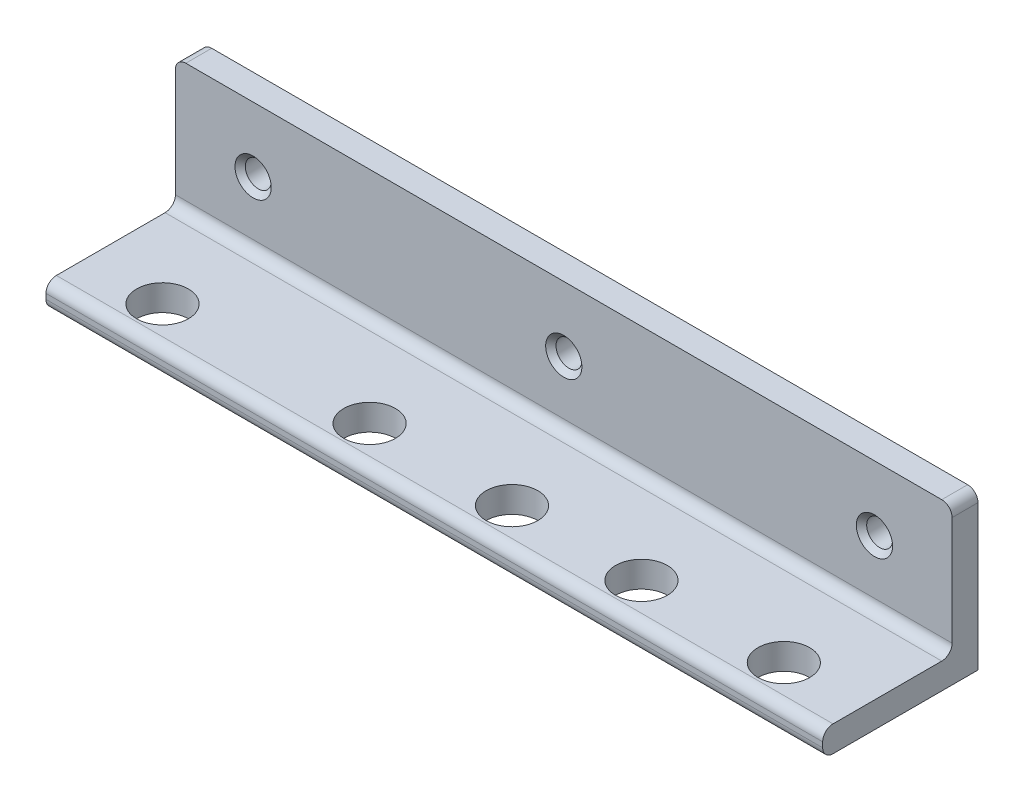
ISO-10303-21;
HEADER;
FILE_DESCRIPTION(('STEP AP214'),'2;1');
FILE_NAME('part.step','',(''),(''),'','','');
FILE_SCHEMA(('AUTOMOTIVE_DESIGN { 1 0 10303 214 1 1 1 1 }'));
ENDSEC;
DATA;
#1=APPLICATION_CONTEXT('core data for automotive mechanical design processes');
#2=APPLICATION_PROTOCOL_DEFINITION('international standard','automotive_design',2000,#1);
#3=PRODUCT_CONTEXT('',#1,'mechanical');
#4=PRODUCT('Part','Part','',(#3));
#5=PRODUCT_RELATED_PRODUCT_CATEGORY('part','',(#4));
#6=PRODUCT_DEFINITION_FORMATION('','',#4);
#7=PRODUCT_DEFINITION_CONTEXT('part definition',#1,'design');
#8=PRODUCT_DEFINITION('design','',#6,#7);
#9=PRODUCT_DEFINITION_SHAPE('','',#8);
#10=(LENGTH_UNIT() NAMED_UNIT(*) SI_UNIT(.MILLI.,.METRE.));
#11=(NAMED_UNIT(*) PLANE_ANGLE_UNIT() SI_UNIT($,.RADIAN.));
#12=(NAMED_UNIT(*) SI_UNIT($,.STERADIAN.) SOLID_ANGLE_UNIT());
#13=UNCERTAINTY_MEASURE_WITH_UNIT(LENGTH_MEASURE(1.E-05),#10,'distance_accuracy_value','');
#14=(GEOMETRIC_REPRESENTATION_CONTEXT(3) GLOBAL_UNCERTAINTY_ASSIGNED_CONTEXT((#13)) GLOBAL_UNIT_ASSIGNED_CONTEXT((#10,
#11,#12)) REPRESENTATION_CONTEXT('',''));
#15=CARTESIAN_POINT('',(0.,0.,0.));
#16=DIRECTION('',(0.,0.,1.));
#17=DIRECTION('',(1.,0.,0.));
#18=AXIS2_PLACEMENT_3D('',#15,#16,#17);
#19=CARTESIAN_POINT('',(0.,5.,0.));
#20=DIRECTION('',(0.,-1.,0.));
#21=DIRECTION('',(0.,0.,-1.));
#22=AXIS2_PLACEMENT_3D('',#19,#20,#21);
#23=PLANE('',#22);
#24=CARTESIAN_POINT('',(-37.6911971364308,5.,8.3157155240969));
#25=DIRECTION('',(0.,1.,0.));
#26=DIRECTION('',(0.,0.,-1.));
#27=AXIS2_PLACEMENT_3D('',#24,#25,#26);
#28=CIRCLE('',#27,5.);
#29=CARTESIAN_POINT('',(-37.6911971364308,5.,3.3157155240969));
#30=VERTEX_POINT('',#29);
#31=EDGE_CURVE('E265',#30,#30,#28,.T.);
#32=ORIENTED_EDGE('',*,*,#31,.F.);
#33=EDGE_LOOP('',(#32));
#34=FACE_BOUND('',#33,.T.);
#35=CARTESIAN_POINT('',(2.30880286356919,5.,8.3157155240969));
#36=DIRECTION('',(0.,1.,0.));
#37=DIRECTION('',(0.,0.,-1.));
#38=AXIS2_PLACEMENT_3D('',#35,#36,#37);
#39=CIRCLE('',#38,4.99999999999999);
#40=CARTESIAN_POINT('',(2.30880286356919,5.,3.31571552409691));
#41=VERTEX_POINT('',#40);
#42=EDGE_CURVE('E261',#41,#41,#39,.T.);
#43=ORIENTED_EDGE('',*,*,#42,.F.);
#44=EDGE_LOOP('',(#43));
#45=FACE_BOUND('',#44,.T.);
#46=CARTESIAN_POINT('',(29.8088028635692,5.,8.3157155240969));
#47=DIRECTION('',(0.,1.,0.));
#48=DIRECTION('',(0.,0.,-1.));
#49=AXIS2_PLACEMENT_3D('',#46,#47,#48);
#50=CIRCLE('',#49,5.00000000000002);
#51=CARTESIAN_POINT('',(29.8088028635692,5.,3.31571552409688));
#52=VERTEX_POINT('',#51);
#53=EDGE_CURVE('E257',#52,#52,#50,.T.);
#54=ORIENTED_EDGE('',*,*,#53,.F.);
#55=EDGE_LOOP('',(#54));
#56=FACE_BOUND('',#55,.T.);
#57=CARTESIAN_POINT('',(54.8088028635692,5.,8.3157155240969));
#58=DIRECTION('',(0.,1.,0.));
#59=DIRECTION('',(0.,0.,-1.));
#60=AXIS2_PLACEMENT_3D('',#57,#58,#59);
#61=CIRCLE('',#60,5.00000000000002);
#62=CARTESIAN_POINT('',(54.8088028635692,5.,3.31571552409688));
#63=VERTEX_POINT('',#62);
#64=EDGE_CURVE('E253',#63,#63,#61,.T.);
#65=ORIENTED_EDGE('',*,*,#64,.F.);
#66=EDGE_LOOP('',(#65));
#67=FACE_BOUND('',#66,.T.);
#68=CARTESIAN_POINT('',(82.3088028635692,5.,8.3157155240969));
#69=DIRECTION('',(0.,1.,0.));
#70=DIRECTION('',(0.,0.,-1.));
#71=AXIS2_PLACEMENT_3D('',#68,#69,#70);
#72=CIRCLE('',#71,4.99999999999999);
#73=CARTESIAN_POINT('',(82.3088028635692,5.,3.31571552409691));
#74=VERTEX_POINT('',#73);
#75=EDGE_CURVE('E249',#74,#74,#72,.T.);
#76=ORIENTED_EDGE('',*,*,#75,.F.);
#77=EDGE_LOOP('',(#76));
#78=FACE_BOUND('',#77,.T.);
#79=DIRECTION('',(0.,0.,1.));
#80=VECTOR('',#79,1.);
#81=CARTESIAN_POINT('',(-52.6911971364308,5.,15.8157155240969));
#82=LINE('',#81,#80);
#83=CARTESIAN_POINT('',(-52.6911971364308,5.,-7.1842844759031));
#84=VERTEX_POINT('',#83);
#85=CARTESIAN_POINT('',(-52.6911971364308,5.,13.8157155240969));
#86=VERTEX_POINT('',#85);
#87=EDGE_CURVE('E139',#84,#86,#82,.T.);
#88=ORIENTED_EDGE('',*,*,#87,.T.);
#89=DIRECTION('',(1.,0.,0.));
#90=VECTOR('',#89,1.);
#91=CARTESIAN_POINT('',(0.,5.,13.8157155240969));
#92=LINE('',#91,#90);
#93=CARTESIAN_POINT('',(97.3088028635692,5.,13.8157155240969));
#94=VERTEX_POINT('',#93);
#95=EDGE_CURVE('E163',#86,#94,#92,.T.);
#96=ORIENTED_EDGE('',*,*,#95,.T.);
#97=DIRECTION('',(0.,0.,-1.));
#98=VECTOR('',#97,1.);
#99=CARTESIAN_POINT('',(97.3088028635692,5.,15.8157155240969));
#100=LINE('',#99,#98);
#101=CARTESIAN_POINT('',(97.3088028635692,5.,-7.18428447590311));
#102=VERTEX_POINT('',#101);
#103=EDGE_CURVE('E142',#94,#102,#100,.T.);
#104=ORIENTED_EDGE('',*,*,#103,.T.);
#105=DIRECTION('',(1.,0.,0.));
#106=VECTOR('',#105,1.);
#107=CARTESIAN_POINT('',(-52.6911971364308,5.,-7.1842844759031));
#108=LINE('',#107,#106);
#109=EDGE_CURVE('E205',#102,#84,#108,.F.);
#110=ORIENTED_EDGE('',*,*,#109,.T.);
#111=EDGE_LOOP('',(#88,#96,#104,#110));
#112=FACE_BOUND('',#111,.T.);
#113=ADVANCED_FACE('F33',(#34,#45,#56,#67,#78,#112),#23,.F.);
#114=CARTESIAN_POINT('',(-52.6911971364308,5.,15.8157155240969));
#115=DIRECTION('',(1.,0.,0.));
#116=DIRECTION('',(0.,0.,-1.));
#117=AXIS2_PLACEMENT_3D('',#114,#115,#116);
#118=PLANE('',#117);
#119=DIRECTION('',(0.,-1.,0.));
#120=VECTOR('',#119,1.);
#121=CARTESIAN_POINT('',(-52.6911971364308,5.,15.8157155240969));
#122=LINE('',#121,#120);
#123=CARTESIAN_POINT('',(-52.6911971364308,3.,15.8157155240969));
#124=VERTEX_POINT('',#123);
#125=CARTESIAN_POINT('',(-52.6911971364308,2.,15.8157155240969));
#126=VERTEX_POINT('',#125);
#127=EDGE_CURVE('E148',#124,#126,#122,.T.);
#128=ORIENTED_EDGE('',*,*,#127,.F.);
#129=CARTESIAN_POINT('',(-52.6911971364308,3.,13.8157155240969));
#130=DIRECTION('',(1.,0.,0.));
#131=DIRECTION('',(0.,0.,-1.));
#132=AXIS2_PLACEMENT_3D('',#129,#130,#131);
#133=CIRCLE('',#132,2.);
#134=EDGE_CURVE('E181',#124,#86,#133,.F.);
#135=ORIENTED_EDGE('',*,*,#134,.T.);
#136=ORIENTED_EDGE('',*,*,#87,.F.);
#137=CARTESIAN_POINT('',(-52.6911971364308,7.,-7.1842844759031));
#138=DIRECTION('',(1.,0.,0.));
#139=DIRECTION('',(0.,0.,-1.));
#140=AXIS2_PLACEMENT_3D('',#137,#138,#139);
#141=CIRCLE('',#140,2.);
#142=CARTESIAN_POINT('',(-52.6911971364308,7.,-9.1842844759031));
#143=VERTEX_POINT('',#142);
#144=EDGE_CURVE('E11',#84,#143,#141,.T.);
#145=ORIENTED_EDGE('',*,*,#144,.T.);
#146=DIRECTION('',(0.,-1.,0.));
#147=VECTOR('',#146,1.);
#148=CARTESIAN_POINT('',(-52.6911971364308,30.,-9.1842844759031));
#149=LINE('',#148,#147);
#150=CARTESIAN_POINT('',(-52.6911971364308,28.,-9.1842844759031));
#151=VERTEX_POINT('',#150);
#152=EDGE_CURVE('E161',#151,#143,#149,.T.);
#153=ORIENTED_EDGE('',*,*,#152,.F.);
#154=DIRECTION('',(0.,0.,1.));
#155=VECTOR('',#154,1.);
#156=CARTESIAN_POINT('',(-52.6911971364308,28.,-14.1842844759031));
#157=LINE('',#156,#155);
#158=CARTESIAN_POINT('',(-52.6911971364308,28.,-14.1842844759031));
#159=VERTEX_POINT('',#158);
#160=EDGE_CURVE('E175',#151,#159,#157,.F.);
#161=ORIENTED_EDGE('',*,*,#160,.T.);
#162=DIRECTION('',(0.,-1.,0.));
#163=VECTOR('',#162,1.);
#164=CARTESIAN_POINT('',(-52.6911971364308,5.,-14.1842844759031));
#165=LINE('',#164,#163);
#166=CARTESIAN_POINT('',(-52.6911971364308,0.,-14.1842844759031));
#167=VERTEX_POINT('',#166);
#168=EDGE_CURVE('E125',#159,#167,#165,.T.);
#169=ORIENTED_EDGE('',*,*,#168,.T.);
#170=DIRECTION('',(0.,0.,1.));
#171=VECTOR('',#170,1.);
#172=CARTESIAN_POINT('',(-52.6911971364308,0.,15.8157155240969));
#173=LINE('',#172,#171);
#174=CARTESIAN_POINT('',(-52.6911971364308,0.,13.8157155240969));
#175=VERTEX_POINT('',#174);
#176=EDGE_CURVE('E135',#167,#175,#173,.T.);
#177=ORIENTED_EDGE('',*,*,#176,.T.);
#178=CARTESIAN_POINT('',(-52.6911971364308,2.,13.8157155240969));
#179=DIRECTION('',(1.,0.,0.));
#180=DIRECTION('',(0.,0.,-1.));
#181=AXIS2_PLACEMENT_3D('',#178,#179,#180);
#182=CIRCLE('',#181,2.);
#183=EDGE_CURVE('E179',#175,#126,#182,.F.);
#184=ORIENTED_EDGE('',*,*,#183,.T.);
#185=EDGE_LOOP('',(#128,#135,#136,#145,#153,#161,#169,#177,#184));
#186=FACE_BOUND('',#185,.T.);
#187=ADVANCED_FACE('F223',(#186),#118,.F.);
#188=CARTESIAN_POINT('',(-52.6911971364308,5.,15.8157155240969));
#189=DIRECTION('',(0.,0.,-1.));
#190=DIRECTION('',(-1.,0.,0.));
#191=AXIS2_PLACEMENT_3D('',#188,#189,#190);
#192=PLANE('',#191);
#193=DIRECTION('',(0.,-1.,0.));
#194=VECTOR('',#193,1.);
#195=CARTESIAN_POINT('',(97.3088028635692,5.,15.8157155240969));
#196=LINE('',#195,#194);
#197=CARTESIAN_POINT('',(97.3088028635692,3.,15.8157155240969));
#198=VERTEX_POINT('',#197);
#199=CARTESIAN_POINT('',(97.3088028635692,2.,15.8157155240969));
#200=VERTEX_POINT('',#199);
#201=EDGE_CURVE('E124',#198,#200,#196,.T.);
#202=ORIENTED_EDGE('',*,*,#201,.F.);
#203=DIRECTION('',(1.,0.,0.));
#204=VECTOR('',#203,1.);
#205=CARTESIAN_POINT('',(-52.6911971364308,3.,15.8157155240969));
#206=LINE('',#205,#204);
#207=EDGE_CURVE('E173',#198,#124,#206,.F.);
#208=ORIENTED_EDGE('',*,*,#207,.T.);
#209=ORIENTED_EDGE('',*,*,#127,.T.);
#210=DIRECTION('',(1.,0.,0.));
#211=VECTOR('',#210,1.);
#212=CARTESIAN_POINT('',(97.3088028635692,2.,15.8157155240969));
#213=LINE('',#212,#211);
#214=EDGE_CURVE('E170',#126,#200,#213,.T.);
#215=ORIENTED_EDGE('',*,*,#214,.T.);
#216=EDGE_LOOP('',(#202,#208,#209,#215));
#217=FACE_BOUND('',#216,.T.);
#218=ADVANCED_FACE('F229',(#217),#192,.F.);
#219=CARTESIAN_POINT('',(97.3088028635692,5.,15.8157155240969));
#220=DIRECTION('',(-1.,0.,0.));
#221=DIRECTION('',(0.,0.,1.));
#222=AXIS2_PLACEMENT_3D('',#219,#220,#221);
#223=PLANE('',#222);
#224=ORIENTED_EDGE('',*,*,#103,.F.);
#225=CARTESIAN_POINT('',(97.3088028635692,3.,13.8157155240969));
#226=DIRECTION('',(-1.,0.,0.));
#227=DIRECTION('',(0.,0.,1.));
#228=AXIS2_PLACEMENT_3D('',#225,#226,#227);
#229=CIRCLE('',#228,2.);
#230=EDGE_CURVE('E168',#94,#198,#229,.F.);
#231=ORIENTED_EDGE('',*,*,#230,.T.);
#232=ORIENTED_EDGE('',*,*,#201,.T.);
#233=CARTESIAN_POINT('',(97.3088028635692,2.,13.8157155240969));
#234=DIRECTION('',(-1.,0.,0.));
#235=DIRECTION('',(0.,0.,1.));
#236=AXIS2_PLACEMENT_3D('',#233,#234,#235);
#237=CIRCLE('',#236,2.);
#238=CARTESIAN_POINT('',(97.3088028635692,0.,13.8157155240969));
#239=VERTEX_POINT('',#238);
#240=EDGE_CURVE('E132',#200,#239,#237,.F.);
#241=ORIENTED_EDGE('',*,*,#240,.T.);
#242=DIRECTION('',(0.,0.,-1.));
#243=VECTOR('',#242,1.);
#244=CARTESIAN_POINT('',(97.3088028635692,0.,15.8157155240969));
#245=LINE('',#244,#243);
#246=CARTESIAN_POINT('',(97.3088028635692,0.,-14.1842844759031));
#247=VERTEX_POINT('',#246);
#248=EDGE_CURVE('E128',#239,#247,#245,.T.);
#249=ORIENTED_EDGE('',*,*,#248,.T.);
#250=DIRECTION('',(0.,-1.,0.));
#251=VECTOR('',#250,1.);
#252=CARTESIAN_POINT('',(97.3088028635692,5.,-14.1842844759031));
#253=LINE('',#252,#251);
#254=CARTESIAN_POINT('',(97.3088028635692,28.,-14.1842844759031));
#255=VERTEX_POINT('',#254);
#256=EDGE_CURVE('E117',#255,#247,#253,.T.);
#257=ORIENTED_EDGE('',*,*,#256,.F.);
#258=DIRECTION('',(0.,0.,-1.));
#259=VECTOR('',#258,1.);
#260=CARTESIAN_POINT('',(97.3088028635692,28.,-9.18428447590311));
#261=LINE('',#260,#259);
#262=CARTESIAN_POINT('',(97.3088028635692,28.,-9.18428447590311));
#263=VERTEX_POINT('',#262);
#264=EDGE_CURVE('E165',#255,#263,#261,.F.);
#265=ORIENTED_EDGE('',*,*,#264,.T.);
#266=DIRECTION('',(0.,-1.,0.));
#267=VECTOR('',#266,1.);
#268=CARTESIAN_POINT('',(97.3088028635692,30.,-9.18428447590311));
#269=LINE('',#268,#267);
#270=CARTESIAN_POINT('',(97.3088028635692,7.,-9.18428447590311));
#271=VERTEX_POINT('',#270);
#272=EDGE_CURVE('E157',#263,#271,#269,.T.);
#273=ORIENTED_EDGE('',*,*,#272,.T.);
#274=CARTESIAN_POINT('',(97.3088028635692,7.,-7.18428447590311));
#275=DIRECTION('',(-1.,0.,0.));
#276=DIRECTION('',(0.,0.,1.));
#277=AXIS2_PLACEMENT_3D('',#274,#275,#276);
#278=CIRCLE('',#277,2.);
#279=EDGE_CURVE('E41',#271,#102,#278,.T.);
#280=ORIENTED_EDGE('',*,*,#279,.T.);
#281=EDGE_LOOP('',(#224,#231,#232,#241,#249,#257,#265,#273,#280));
#282=FACE_BOUND('',#281,.T.);
#283=ADVANCED_FACE('F130',(#282),#223,.F.);
#284=CARTESIAN_POINT('',(-52.6911971364308,5.,-14.1842844759031));
#285=DIRECTION('',(0.,0.,1.));
#286=DIRECTION('',(1.,0.,0.));
#287=AXIS2_PLACEMENT_3D('',#284,#285,#286);
#288=PLANE('',#287);
#289=CARTESIAN_POINT('',(22.3088028635692,17.4786642448446,-14.1842844759031));
#290=DIRECTION('',(0.,0.,1.));
#291=DIRECTION('',(1.,0.,0.));
#292=AXIS2_PLACEMENT_3D('',#289,#290,#291);
#293=CIRCLE('',#292,2.5);
#294=CARTESIAN_POINT('',(24.8088028635692,17.4786642448446,-14.1842844759031));
#295=VERTEX_POINT('',#294);
#296=EDGE_CURVE('E274',#295,#295,#293,.T.);
#297=ORIENTED_EDGE('',*,*,#296,.T.);
#298=EDGE_LOOP('',(#297));
#299=FACE_BOUND('',#298,.T.);
#300=CARTESIAN_POINT('',(-37.6911971364308,17.4786642448446,-14.1842844759031));
#301=DIRECTION('',(0.,0.,1.));
#302=DIRECTION('',(1.,0.,0.));
#303=AXIS2_PLACEMENT_3D('',#300,#301,#302);
#304=CIRCLE('',#303,2.49999999999999);
#305=CARTESIAN_POINT('',(-35.1911971364308,17.4786642448446,-14.1842844759031));
#306=VERTEX_POINT('',#305);
#307=EDGE_CURVE('E271',#306,#306,#304,.T.);
#308=ORIENTED_EDGE('',*,*,#307,.T.);
#309=EDGE_LOOP('',(#308));
#310=FACE_BOUND('',#309,.T.);
#311=CARTESIAN_POINT('',(82.3088028635692,17.4786642448446,-14.1842844759031));
#312=DIRECTION('',(0.,0.,1.));
#313=DIRECTION('',(1.,0.,0.));
#314=AXIS2_PLACEMENT_3D('',#311,#312,#313);
#315=CIRCLE('',#314,2.50000000000001);
#316=CARTESIAN_POINT('',(84.8088028635692,17.4786642448446,-14.1842844759031));
#317=VERTEX_POINT('',#316);
#318=EDGE_CURVE('E268',#317,#317,#315,.T.);
#319=ORIENTED_EDGE('',*,*,#318,.T.);
#320=EDGE_LOOP('',(#319));
#321=FACE_BOUND('',#320,.T.);
#322=ORIENTED_EDGE('',*,*,#168,.F.);
#323=CARTESIAN_POINT('',(-50.6911971364308,28.,-14.1842844759031));
#324=DIRECTION('',(0.,0.,1.));
#325=DIRECTION('',(1.,0.,0.));
#326=AXIS2_PLACEMENT_3D('',#323,#324,#325);
#327=CIRCLE('',#326,2.);
#328=CARTESIAN_POINT('',(-50.6911971364308,30.,-14.1842844759031));
#329=VERTEX_POINT('',#328);
#330=EDGE_CURVE('E48',#159,#329,#327,.F.);
#331=ORIENTED_EDGE('',*,*,#330,.T.);
#332=DIRECTION('',(-1.,0.,0.));
#333=VECTOR('',#332,1.);
#334=CARTESIAN_POINT('',(-52.6911971364308,30.,-14.1842844759031));
#335=LINE('',#334,#333);
#336=CARTESIAN_POINT('',(95.3088028635692,30.,-14.1842844759031));
#337=VERTEX_POINT('',#336);
#338=EDGE_CURVE('E162',#337,#329,#335,.T.);
#339=ORIENTED_EDGE('',*,*,#338,.F.);
#340=CARTESIAN_POINT('',(95.3088028635692,28.,-14.1842844759031));
#341=DIRECTION('',(0.,0.,1.));
#342=DIRECTION('',(1.,0.,0.));
#343=AXIS2_PLACEMENT_3D('',#340,#341,#342);
#344=CIRCLE('',#343,2.);
#345=EDGE_CURVE('E56',#337,#255,#344,.F.);
#346=ORIENTED_EDGE('',*,*,#345,.T.);
#347=ORIENTED_EDGE('',*,*,#256,.T.);
#348=DIRECTION('',(-1.,0.,0.));
#349=VECTOR('',#348,1.);
#350=CARTESIAN_POINT('',(-52.6911971364308,0.,-14.1842844759031));
#351=LINE('',#350,#349);
#352=EDGE_CURVE('E121',#247,#167,#351,.T.);
#353=ORIENTED_EDGE('',*,*,#352,.T.);
#354=EDGE_LOOP('',(#322,#331,#339,#346,#347,#353));
#355=FACE_BOUND('',#354,.T.);
#356=ADVANCED_FACE('F119',(#299,#310,#321,#355),#288,.F.);
#357=CARTESIAN_POINT('',(0.,0.,0.));
#358=DIRECTION('',(0.,-1.,0.));
#359=DIRECTION('',(0.,0.,-1.));
#360=AXIS2_PLACEMENT_3D('',#357,#358,#359);
#361=PLANE('',#360);
#362=CARTESIAN_POINT('',(-37.6911971364308,0.,8.3157155240969));
#363=DIRECTION('',(0.,-1.,0.));
#364=DIRECTION('',(0.,0.,-1.));
#365=AXIS2_PLACEMENT_3D('',#362,#363,#364);
#366=CIRCLE('',#365,5.);
#367=CARTESIAN_POINT('',(-37.6911971364308,0.,3.3157155240969));
#368=VERTEX_POINT('',#367);
#369=EDGE_CURVE('E264',#368,#368,#366,.T.);
#370=ORIENTED_EDGE('',*,*,#369,.F.);
#371=EDGE_LOOP('',(#370));
#372=FACE_BOUND('',#371,.T.);
#373=CARTESIAN_POINT('',(2.30880286356919,0.,8.3157155240969));
#374=DIRECTION('',(0.,-1.,0.));
#375=DIRECTION('',(0.,0.,-1.));
#376=AXIS2_PLACEMENT_3D('',#373,#374,#375);
#377=CIRCLE('',#376,4.99999999999999);
#378=CARTESIAN_POINT('',(2.30880286356919,0.,3.31571552409691));
#379=VERTEX_POINT('',#378);
#380=EDGE_CURVE('E260',#379,#379,#377,.T.);
#381=ORIENTED_EDGE('',*,*,#380,.F.);
#382=EDGE_LOOP('',(#381));
#383=FACE_BOUND('',#382,.T.);
#384=CARTESIAN_POINT('',(29.8088028635692,0.,8.3157155240969));
#385=DIRECTION('',(0.,-1.,0.));
#386=DIRECTION('',(0.,0.,-1.));
#387=AXIS2_PLACEMENT_3D('',#384,#385,#386);
#388=CIRCLE('',#387,5.00000000000002);
#389=CARTESIAN_POINT('',(29.8088028635692,0.,3.31571552409688));
#390=VERTEX_POINT('',#389);
#391=EDGE_CURVE('E256',#390,#390,#388,.T.);
#392=ORIENTED_EDGE('',*,*,#391,.F.);
#393=EDGE_LOOP('',(#392));
#394=FACE_BOUND('',#393,.T.);
#395=CARTESIAN_POINT('',(54.8088028635692,0.,8.3157155240969));
#396=DIRECTION('',(0.,-1.,0.));
#397=DIRECTION('',(0.,0.,-1.));
#398=AXIS2_PLACEMENT_3D('',#395,#396,#397);
#399=CIRCLE('',#398,5.00000000000002);
#400=CARTESIAN_POINT('',(54.8088028635692,0.,3.31571552409688));
#401=VERTEX_POINT('',#400);
#402=EDGE_CURVE('E252',#401,#401,#399,.T.);
#403=ORIENTED_EDGE('',*,*,#402,.F.);
#404=EDGE_LOOP('',(#403));
#405=FACE_BOUND('',#404,.T.);
#406=CARTESIAN_POINT('',(82.3088028635692,0.,8.3157155240969));
#407=DIRECTION('',(0.,-1.,0.));
#408=DIRECTION('',(0.,0.,-1.));
#409=AXIS2_PLACEMENT_3D('',#406,#407,#408);
#410=CIRCLE('',#409,4.99999999999999);
#411=CARTESIAN_POINT('',(82.3088028635692,0.,3.31571552409691));
#412=VERTEX_POINT('',#411);
#413=EDGE_CURVE('E246',#412,#412,#410,.T.);
#414=ORIENTED_EDGE('',*,*,#413,.F.);
#415=EDGE_LOOP('',(#414));
#416=FACE_BOUND('',#415,.T.);
#417=ORIENTED_EDGE('',*,*,#248,.F.);
#418=DIRECTION('',(1.,0.,0.));
#419=VECTOR('',#418,1.);
#420=CARTESIAN_POINT('',(-52.6911971364308,0.,13.8157155240969));
#421=LINE('',#420,#419);
#422=EDGE_CURVE('E183',#239,#175,#421,.F.);
#423=ORIENTED_EDGE('',*,*,#422,.T.);
#424=ORIENTED_EDGE('',*,*,#176,.F.);
#425=ORIENTED_EDGE('',*,*,#352,.F.);
#426=EDGE_LOOP('',(#417,#423,#424,#425));
#427=FACE_BOUND('',#426,.T.);
#428=ADVANCED_FACE('F137',(#372,#383,#394,#405,#416,#427),#361,.T.);
#429=CARTESIAN_POINT('',(-52.6911971364308,30.,-9.1842844759031));
#430=DIRECTION('',(0.,0.,-1.));
#431=DIRECTION('',(-1.,0.,0.));
#432=AXIS2_PLACEMENT_3D('',#429,#430,#431);
#433=PLANE('',#432);
#434=CARTESIAN_POINT('',(22.3088028635692,17.4786642448446,-9.1842844759031));
#435=DIRECTION('',(0.,0.,-1.));
#436=DIRECTION('',(-1.,0.,0.));
#437=AXIS2_PLACEMENT_3D('',#434,#435,#436);
#438=CIRCLE('',#437,3.50000000000002);
#439=CARTESIAN_POINT('',(18.8088028635692,17.4786642448446,-9.1842844759031));
#440=VERTEX_POINT('',#439);
#441=EDGE_CURVE('E524',#440,#440,#438,.T.);
#442=ORIENTED_EDGE('',*,*,#441,.T.);
#443=EDGE_LOOP('',(#442));
#444=FACE_BOUND('',#443,.T.);
#445=CARTESIAN_POINT('',(-37.6911971364308,17.4786642448446,-9.1842844759031));
#446=DIRECTION('',(0.,0.,-1.));
#447=DIRECTION('',(-1.,0.,0.));
#448=AXIS2_PLACEMENT_3D('',#445,#446,#447);
#449=CIRCLE('',#448,3.49999999999998);
#450=CARTESIAN_POINT('',(-41.1911971364308,17.4786642448446,-9.1842844759031));
#451=VERTEX_POINT('',#450);
#452=EDGE_CURVE('E521',#451,#451,#449,.T.);
#453=ORIENTED_EDGE('',*,*,#452,.T.);
#454=EDGE_LOOP('',(#453));
#455=FACE_BOUND('',#454,.T.);
#456=CARTESIAN_POINT('',(82.3088028635692,17.4786642448446,-9.18428447590311));
#457=DIRECTION('',(0.,0.,-1.));
#458=DIRECTION('',(-1.,0.,0.));
#459=AXIS2_PLACEMENT_3D('',#456,#457,#458);
#460=CIRCLE('',#459,3.50000000000006);
#461=CARTESIAN_POINT('',(78.8088028635691,17.4786642448446,-9.18428447590311));
#462=VERTEX_POINT('',#461);
#463=EDGE_CURVE('E518',#462,#462,#460,.T.);
#464=ORIENTED_EDGE('',*,*,#463,.T.);
#465=EDGE_LOOP('',(#464));
#466=FACE_BOUND('',#465,.T.);
#467=ORIENTED_EDGE('',*,*,#152,.T.);
#468=DIRECTION('',(1.,0.,0.));
#469=VECTOR('',#468,1.);
#470=CARTESIAN_POINT('',(97.3088028635692,7.,-9.18428447590311));
#471=LINE('',#470,#469);
#472=EDGE_CURVE('E189',#143,#271,#471,.T.);
#473=ORIENTED_EDGE('',*,*,#472,.T.);
#474=ORIENTED_EDGE('',*,*,#272,.F.);
#475=CARTESIAN_POINT('',(95.3088028635692,28.,-9.18428447590311));
#476=DIRECTION('',(0.,0.,-1.));
#477=DIRECTION('',(-1.,0.,0.));
#478=AXIS2_PLACEMENT_3D('',#475,#476,#477);
#479=CIRCLE('',#478,2.);
#480=CARTESIAN_POINT('',(95.3088028635692,30.,-9.18428447590311));
#481=VERTEX_POINT('',#480);
#482=EDGE_CURVE('E185',#263,#481,#479,.F.);
#483=ORIENTED_EDGE('',*,*,#482,.T.);
#484=DIRECTION('',(1.,0.,0.));
#485=VECTOR('',#484,1.);
#486=CARTESIAN_POINT('',(-52.6911971364308,30.,-9.1842844759031));
#487=LINE('',#486,#485);
#488=CARTESIAN_POINT('',(-50.6911971364308,30.,-9.1842844759031));
#489=VERTEX_POINT('',#488);
#490=EDGE_CURVE('E240',#489,#481,#487,.T.);
#491=ORIENTED_EDGE('',*,*,#490,.F.);
#492=CARTESIAN_POINT('',(-50.6911971364308,28.,-9.1842844759031));
#493=DIRECTION('',(0.,0.,-1.));
#494=DIRECTION('',(-1.,0.,0.));
#495=AXIS2_PLACEMENT_3D('',#492,#493,#494);
#496=CIRCLE('',#495,2.);
#497=EDGE_CURVE('E187',#489,#151,#496,.F.);
#498=ORIENTED_EDGE('',*,*,#497,.T.);
#499=EDGE_LOOP('',(#467,#473,#474,#483,#491,#498));
#500=FACE_BOUND('',#499,.T.);
#501=ADVANCED_FACE('F237',(#444,#455,#466,#500),#433,.F.);
#502=CARTESIAN_POINT('',(0.,30.,0.));
#503=DIRECTION('',(0.,1.,0.));
#504=DIRECTION('',(0.,0.,1.));
#505=AXIS2_PLACEMENT_3D('',#502,#503,#504);
#506=PLANE('',#505);
#507=ORIENTED_EDGE('',*,*,#338,.T.);
#508=DIRECTION('',(0.,0.,1.));
#509=VECTOR('',#508,1.);
#510=CARTESIAN_POINT('',(-50.6911971364308,30.,-9.1842844759031));
#511=LINE('',#510,#509);
#512=EDGE_CURVE('E194',#329,#489,#511,.T.);
#513=ORIENTED_EDGE('',*,*,#512,.T.);
#514=ORIENTED_EDGE('',*,*,#490,.T.);
#515=DIRECTION('',(0.,0.,-1.));
#516=VECTOR('',#515,1.);
#517=CARTESIAN_POINT('',(95.3088028635692,30.,-14.1842844759031));
#518=LINE('',#517,#516);
#519=EDGE_CURVE('E192',#481,#337,#518,.T.);
#520=ORIENTED_EDGE('',*,*,#519,.T.);
#521=EDGE_LOOP('',(#507,#513,#514,#520));
#522=FACE_BOUND('',#521,.T.);
#523=ADVANCED_FACE('F245',(#522),#506,.T.);
#524=CARTESIAN_POINT('',(82.3088028635692,-20.,8.3157155240969));
#525=DIRECTION('',(0.,1.,0.));
#526=DIRECTION('',(0.,0.,1.));
#527=AXIS2_PLACEMENT_3D('',#524,#525,#526);
#528=CYLINDRICAL_SURFACE('',#527,4.99999999999999);
#529=ORIENTED_EDGE('',*,*,#413,.T.);
#530=EDGE_LOOP('',(#529));
#531=FACE_BOUND('',#530,.T.);
#532=ORIENTED_EDGE('',*,*,#75,.T.);
#533=EDGE_LOOP('',(#532));
#534=FACE_BOUND('',#533,.T.);
#535=ADVANCED_FACE('F369',(#531,#534),#528,.F.);
#536=CARTESIAN_POINT('',(54.8088028635692,-20.,8.3157155240969));
#537=DIRECTION('',(0.,1.,0.));
#538=DIRECTION('',(0.,0.,1.));
#539=AXIS2_PLACEMENT_3D('',#536,#537,#538);
#540=CYLINDRICAL_SURFACE('',#539,5.00000000000002);
#541=ORIENTED_EDGE('',*,*,#402,.T.);
#542=EDGE_LOOP('',(#541));
#543=FACE_BOUND('',#542,.T.);
#544=ORIENTED_EDGE('',*,*,#64,.T.);
#545=EDGE_LOOP('',(#544));
#546=FACE_BOUND('',#545,.T.);
#547=ADVANCED_FACE('F481',(#543,#546),#540,.F.);
#548=CARTESIAN_POINT('',(29.8088028635692,-20.,8.3157155240969));
#549=DIRECTION('',(0.,1.,0.));
#550=DIRECTION('',(0.,0.,1.));
#551=AXIS2_PLACEMENT_3D('',#548,#549,#550);
#552=CYLINDRICAL_SURFACE('',#551,5.00000000000002);
#553=ORIENTED_EDGE('',*,*,#391,.T.);
#554=EDGE_LOOP('',(#553));
#555=FACE_BOUND('',#554,.T.);
#556=ORIENTED_EDGE('',*,*,#53,.T.);
#557=EDGE_LOOP('',(#556));
#558=FACE_BOUND('',#557,.T.);
#559=ADVANCED_FACE('F471',(#555,#558),#552,.F.);
#560=CARTESIAN_POINT('',(2.30880286356919,-20.,8.3157155240969));
#561=DIRECTION('',(0.,1.,0.));
#562=DIRECTION('',(0.,0.,1.));
#563=AXIS2_PLACEMENT_3D('',#560,#561,#562);
#564=CYLINDRICAL_SURFACE('',#563,4.99999999999999);
#565=ORIENTED_EDGE('',*,*,#380,.T.);
#566=EDGE_LOOP('',(#565));
#567=FACE_BOUND('',#566,.T.);
#568=ORIENTED_EDGE('',*,*,#42,.T.);
#569=EDGE_LOOP('',(#568));
#570=FACE_BOUND('',#569,.T.);
#571=ADVANCED_FACE('F461',(#567,#570),#564,.F.);
#572=CARTESIAN_POINT('',(-37.6911971364308,-20.,8.3157155240969));
#573=DIRECTION('',(0.,1.,0.));
#574=DIRECTION('',(0.,0.,1.));
#575=AXIS2_PLACEMENT_3D('',#572,#573,#574);
#576=CYLINDRICAL_SURFACE('',#575,5.);
#577=ORIENTED_EDGE('',*,*,#369,.T.);
#578=EDGE_LOOP('',(#577));
#579=FACE_BOUND('',#578,.T.);
#580=ORIENTED_EDGE('',*,*,#31,.T.);
#581=EDGE_LOOP('',(#580));
#582=FACE_BOUND('',#581,.T.);
#583=ADVANCED_FACE('F451',(#579,#582),#576,.F.);
#584=CARTESIAN_POINT('',(82.3088028635692,17.4786642448446,-34.1842844759031));
#585=DIRECTION('',(0.,0.,1.));
#586=DIRECTION('',(1.,0.,0.));
#587=AXIS2_PLACEMENT_3D('',#584,#585,#586);
#588=CYLINDRICAL_SURFACE('',#587,2.50000000000001);
#589=CARTESIAN_POINT('',(82.3088028635692,17.4786642448446,-10.1842844759031));
#590=DIRECTION('',(0.,0.,-1.));
#591=DIRECTION('',(-1.,0.,0.));
#592=AXIS2_PLACEMENT_3D('',#589,#590,#591);
#593=CIRCLE('',#592,2.50000000000001);
#594=CARTESIAN_POINT('',(79.8088028635692,17.4786642448446,-10.1842844759031));
#595=VERTEX_POINT('',#594);
#596=EDGE_CURVE('E211',#595,#595,#593,.F.);
#597=ORIENTED_EDGE('',*,*,#596,.T.);
#598=EDGE_LOOP('',(#597));
#599=FACE_BOUND('',#598,.T.);
#600=ORIENTED_EDGE('',*,*,#318,.F.);
#601=EDGE_LOOP('',(#600));
#602=FACE_BOUND('',#601,.T.);
#603=ADVANCED_FACE('F293',(#599,#602),#588,.F.);
#604=CARTESIAN_POINT('',(-37.6911971364308,17.4786642448446,-34.1842844759031));
#605=DIRECTION('',(0.,0.,1.));
#606=DIRECTION('',(1.,0.,0.));
#607=AXIS2_PLACEMENT_3D('',#604,#605,#606);
#608=CYLINDRICAL_SURFACE('',#607,2.49999999999999);
#609=CARTESIAN_POINT('',(-37.6911971364308,17.4786642448446,-10.1842844759031));
#610=DIRECTION('',(0.,0.,-1.));
#611=DIRECTION('',(-1.,0.,0.));
#612=AXIS2_PLACEMENT_3D('',#609,#610,#611);
#613=CIRCLE('',#612,2.49999999999999);
#614=CARTESIAN_POINT('',(-40.1911971364308,17.4786642448446,-10.1842844759031));
#615=VERTEX_POINT('',#614);
#616=EDGE_CURVE('E213',#615,#615,#613,.F.);
#617=ORIENTED_EDGE('',*,*,#616,.T.);
#618=EDGE_LOOP('',(#617));
#619=FACE_BOUND('',#618,.T.);
#620=ORIENTED_EDGE('',*,*,#307,.F.);
#621=EDGE_LOOP('',(#620));
#622=FACE_BOUND('',#621,.T.);
#623=ADVANCED_FACE('F283',(#619,#622),#608,.F.);
#624=CARTESIAN_POINT('',(22.3088028635692,17.4786642448446,-34.1842844759031));
#625=DIRECTION('',(0.,0.,1.));
#626=DIRECTION('',(1.,0.,0.));
#627=AXIS2_PLACEMENT_3D('',#624,#625,#626);
#628=CYLINDRICAL_SURFACE('',#627,2.5);
#629=CARTESIAN_POINT('',(22.3088028635692,17.4786642448446,-10.1842844759031));
#630=DIRECTION('',(0.,0.,-1.));
#631=DIRECTION('',(-1.,0.,0.));
#632=AXIS2_PLACEMENT_3D('',#629,#630,#631);
#633=CIRCLE('',#632,2.5);
#634=CARTESIAN_POINT('',(19.8088028635692,17.4786642448446,-10.1842844759031));
#635=VERTEX_POINT('',#634);
#636=EDGE_CURVE('E151',#635,#635,#633,.F.);
#637=ORIENTED_EDGE('',*,*,#636,.T.);
#638=EDGE_LOOP('',(#637));
#639=FACE_BOUND('',#638,.T.);
#640=ORIENTED_EDGE('',*,*,#296,.F.);
#641=EDGE_LOOP('',(#640));
#642=FACE_BOUND('',#641,.T.);
#643=ADVANCED_FACE('F280',(#639,#642),#628,.F.);
#644=CARTESIAN_POINT('',(22.3088028635692,17.4786642448446,-10.1842844759031));
#645=DIRECTION('',(0.,0.,1.));
#646=DIRECTION('',(1.,0.,0.));
#647=AXIS2_PLACEMENT_3D('',#644,#645,#646);
#648=CONICAL_SURFACE('',#647,2.5,0.785398163397457);
#649=ORIENTED_EDGE('',*,*,#441,.F.);
#650=EDGE_LOOP('',(#649));
#651=FACE_BOUND('',#650,.T.);
#652=ORIENTED_EDGE('',*,*,#636,.F.);
#653=EDGE_LOOP('',(#652));
#654=FACE_BOUND('',#653,.T.);
#655=ADVANCED_FACE('F282',(#651,#654),#648,.F.);
#656=CARTESIAN_POINT('',(-37.6911971364308,17.4786642448446,-10.1842844759031));
#657=DIRECTION('',(0.,0.,1.));
#658=DIRECTION('',(1.,0.,0.));
#659=AXIS2_PLACEMENT_3D('',#656,#657,#658);
#660=CONICAL_SURFACE('',#659,2.49999999999999,0.785398163397452);
#661=ORIENTED_EDGE('',*,*,#452,.F.);
#662=EDGE_LOOP('',(#661));
#663=FACE_BOUND('',#662,.T.);
#664=ORIENTED_EDGE('',*,*,#616,.F.);
#665=EDGE_LOOP('',(#664));
#666=FACE_BOUND('',#665,.T.);
#667=ADVANCED_FACE('F290',(#663,#666),#660,.F.);
#668=CARTESIAN_POINT('',(82.3088028635692,17.4786642448446,-10.1842844759031));
#669=DIRECTION('',(0.,0.,1.));
#670=DIRECTION('',(1.,0.,0.));
#671=AXIS2_PLACEMENT_3D('',#668,#669,#670);
#672=CONICAL_SURFACE('',#671,2.50000000000001,0.785398163397458);
#673=ORIENTED_EDGE('',*,*,#463,.F.);
#674=EDGE_LOOP('',(#673));
#675=FACE_BOUND('',#674,.T.);
#676=ORIENTED_EDGE('',*,*,#596,.F.);
#677=EDGE_LOOP('',(#676));
#678=FACE_BOUND('',#677,.T.);
#679=ADVANCED_FACE('F320',(#675,#678),#672,.F.);
#680=CARTESIAN_POINT('',(0.,3.,13.8157155240969));
#681=DIRECTION('',(1.,0.,0.));
#682=DIRECTION('',(0.,0.,-1.));
#683=AXIS2_PLACEMENT_3D('',#680,#681,#682);
#684=CYLINDRICAL_SURFACE('',#683,2.);
#685=ORIENTED_EDGE('',*,*,#134,.F.);
#686=ORIENTED_EDGE('',*,*,#207,.F.);
#687=ORIENTED_EDGE('',*,*,#230,.F.);
#688=ORIENTED_EDGE('',*,*,#95,.F.);
#689=EDGE_LOOP('',(#685,#686,#687,#688));
#690=FACE_BOUND('',#689,.T.);
#691=ADVANCED_FACE('F233',(#690),#684,.T.);
#692=CARTESIAN_POINT('',(-52.6911971364308,2.,13.8157155240969));
#693=DIRECTION('',(-1.,0.,0.));
#694=DIRECTION('',(0.,0.,1.));
#695=AXIS2_PLACEMENT_3D('',#692,#693,#694);
#696=CYLINDRICAL_SURFACE('',#695,2.);
#697=ORIENTED_EDGE('',*,*,#183,.F.);
#698=ORIENTED_EDGE('',*,*,#422,.F.);
#699=ORIENTED_EDGE('',*,*,#240,.F.);
#700=ORIENTED_EDGE('',*,*,#214,.F.);
#701=EDGE_LOOP('',(#697,#698,#699,#700));
#702=FACE_BOUND('',#701,.T.);
#703=ADVANCED_FACE('F226',(#702),#696,.T.);
#704=CARTESIAN_POINT('',(-52.6911971364308,7.,-7.1842844759031));
#705=DIRECTION('',(-1.,0.,0.));
#706=DIRECTION('',(0.,0.,1.));
#707=AXIS2_PLACEMENT_3D('',#704,#705,#706);
#708=CYLINDRICAL_SURFACE('',#707,2.);
#709=ORIENTED_EDGE('',*,*,#144,.F.);
#710=ORIENTED_EDGE('',*,*,#109,.F.);
#711=ORIENTED_EDGE('',*,*,#279,.F.);
#712=ORIENTED_EDGE('',*,*,#472,.F.);
#713=EDGE_LOOP('',(#709,#710,#711,#712));
#714=FACE_BOUND('',#713,.T.);
#715=ADVANCED_FACE('F210',(#714),#708,.F.);
#716=CARTESIAN_POINT('',(-50.6911971364308,28.,0.));
#717=DIRECTION('',(0.,0.,-1.));
#718=DIRECTION('',(-1.,0.,0.));
#719=AXIS2_PLACEMENT_3D('',#716,#717,#718);
#720=CYLINDRICAL_SURFACE('',#719,2.);
#721=ORIENTED_EDGE('',*,*,#330,.F.);
#722=ORIENTED_EDGE('',*,*,#160,.F.);
#723=ORIENTED_EDGE('',*,*,#497,.F.);
#724=ORIENTED_EDGE('',*,*,#512,.F.);
#725=EDGE_LOOP('',(#721,#722,#723,#724));
#726=FACE_BOUND('',#725,.T.);
#727=ADVANCED_FACE('F243',(#726),#720,.T.);
#728=CARTESIAN_POINT('',(95.3088028635692,28.,0.));
#729=DIRECTION('',(0.,0.,1.));
#730=DIRECTION('',(1.,0.,0.));
#731=AXIS2_PLACEMENT_3D('',#728,#729,#730);
#732=CYLINDRICAL_SURFACE('',#731,2.);
#733=ORIENTED_EDGE('',*,*,#482,.F.);
#734=ORIENTED_EDGE('',*,*,#264,.F.);
#735=ORIENTED_EDGE('',*,*,#345,.F.);
#736=ORIENTED_EDGE('',*,*,#519,.F.);
#737=EDGE_LOOP('',(#733,#734,#735,#736));
#738=FACE_BOUND('',#737,.T.);
#739=ADVANCED_FACE('F35',(#738),#732,.T.);
#740=CLOSED_SHELL('',(#113,#187,#218,#283,#356,#428,#501,#523,#535,#547,#559,#571,#583,#603,
#623,#643,#655,#667,#679,#691,#703,#715,#727,#739));
#741=MANIFOLD_SOLID_BREP('B2',#740);
#742=ADVANCED_BREP_SHAPE_REPRESENTATION('',(#18,#741),#14);
#743=SHAPE_DEFINITION_REPRESENTATION(#9,#742);
ENDSEC;
END-ISO-10303-21;
